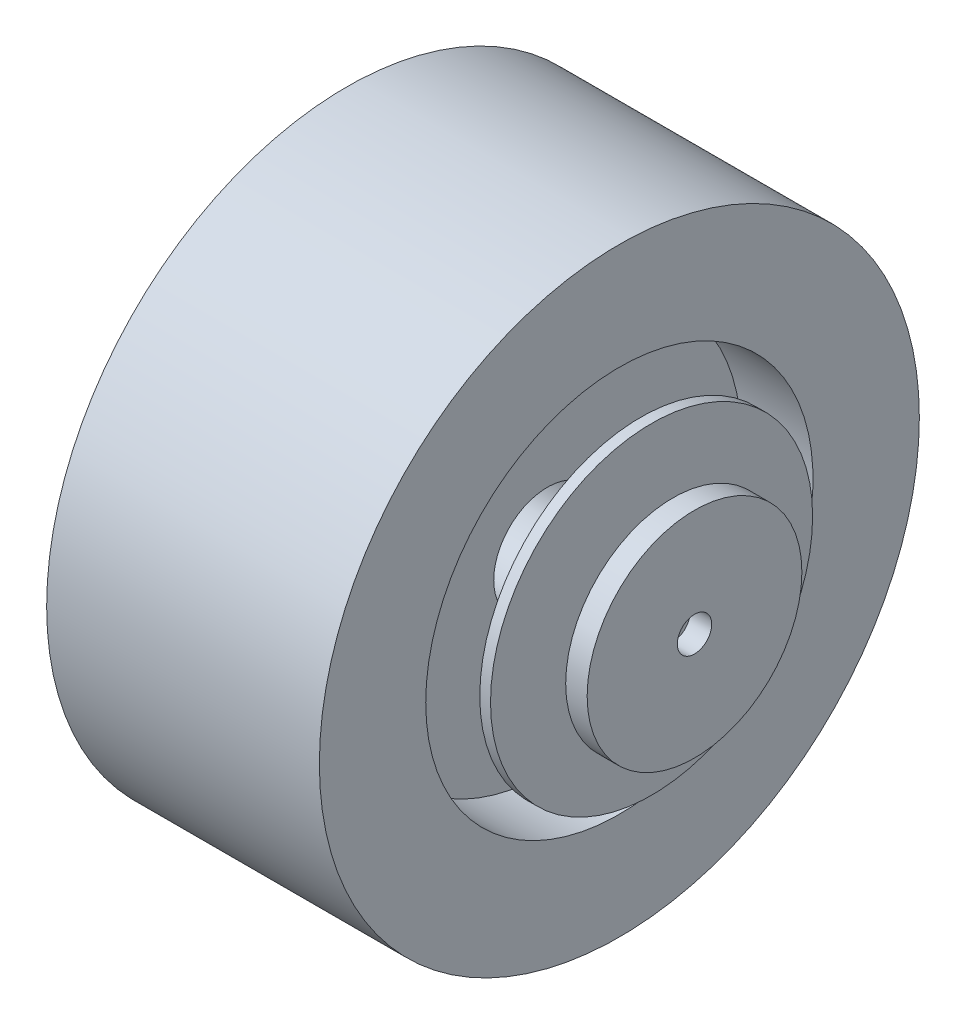
ISO-10303-21;
HEADER;
FILE_DESCRIPTION(('STEP AP214'),'2;1');
FILE_NAME('part.step','',(''),(''),'','','');
FILE_SCHEMA(('AUTOMOTIVE_DESIGN { 1 0 10303 214 1 1 1 1 }'));
ENDSEC;
DATA;
#1=APPLICATION_CONTEXT('core data for automotive mechanical design processes');
#2=APPLICATION_PROTOCOL_DEFINITION('international standard','automotive_design',2000,#1);
#3=PRODUCT_CONTEXT('',#1,'mechanical');
#4=PRODUCT('Part','Part','',(#3));
#5=PRODUCT_RELATED_PRODUCT_CATEGORY('part','',(#4));
#6=PRODUCT_DEFINITION_FORMATION('','',#4);
#7=PRODUCT_DEFINITION_CONTEXT('part definition',#1,'design');
#8=PRODUCT_DEFINITION('design','',#6,#7);
#9=PRODUCT_DEFINITION_SHAPE('','',#8);
#10=(LENGTH_UNIT() NAMED_UNIT(*) SI_UNIT(.MILLI.,.METRE.));
#11=(NAMED_UNIT(*) PLANE_ANGLE_UNIT() SI_UNIT($,.RADIAN.));
#12=(NAMED_UNIT(*) SI_UNIT($,.STERADIAN.) SOLID_ANGLE_UNIT());
#13=UNCERTAINTY_MEASURE_WITH_UNIT(LENGTH_MEASURE(1.E-05),#10,'distance_accuracy_value','');
#14=(GEOMETRIC_REPRESENTATION_CONTEXT(3) GLOBAL_UNCERTAINTY_ASSIGNED_CONTEXT((#13)) GLOBAL_UNIT_ASSIGNED_CONTEXT((#10,
#11,#12)) REPRESENTATION_CONTEXT('',''));
#15=CARTESIAN_POINT('',(0.,0.,0.));
#16=DIRECTION('',(0.,0.,1.));
#17=DIRECTION('',(1.,0.,0.));
#18=AXIS2_PLACEMENT_3D('',#15,#16,#17);
#19=CARTESIAN_POINT('',(98.5,0.,0.));
#20=DIRECTION('',(-1.,0.,0.));
#21=DIRECTION('',(0.,0.,1.));
#22=AXIS2_PLACEMENT_3D('',#19,#20,#21);
#23=CYLINDRICAL_SURFACE('',#22,50.);
#24=CARTESIAN_POINT('',(98.5,0.,0.));
#25=DIRECTION('',(1.,0.,0.));
#26=DIRECTION('',(0.,0.,-1.));
#27=AXIS2_PLACEMENT_3D('',#24,#25,#26);
#28=CIRCLE('',#27,50.);
#29=CARTESIAN_POINT('',(98.5,0.,-50.));
#30=VERTEX_POINT('',#29);
#31=EDGE_CURVE('E11',#30,#30,#28,.T.);
#32=ORIENTED_EDGE('',*,*,#31,.F.);
#33=EDGE_LOOP('',(#32));
#34=FACE_BOUND('',#33,.T.);
#35=CARTESIAN_POINT('',(88.5,0.,0.));
#36=DIRECTION('',(1.,0.,0.));
#37=DIRECTION('',(0.,0.,-1.));
#38=AXIS2_PLACEMENT_3D('',#35,#36,#37);
#39=CIRCLE('',#38,50.);
#40=CARTESIAN_POINT('',(88.5,0.,-50.));
#41=VERTEX_POINT('',#40);
#42=EDGE_CURVE('E63',#41,#41,#39,.T.);
#43=ORIENTED_EDGE('',*,*,#42,.T.);
#44=EDGE_LOOP('',(#43));
#45=FACE_BOUND('',#44,.T.);
#46=ADVANCED_FACE('F56',(#34,#45),#23,.T.);
#47=CARTESIAN_POINT('',(98.5,0.,0.));
#48=DIRECTION('',(1.,0.,0.));
#49=DIRECTION('',(0.,0.,-1.));
#50=AXIS2_PLACEMENT_3D('',#47,#48,#49);
#51=PLANE('',#50);
#52=CARTESIAN_POINT('',(98.5,0.,0.));
#53=DIRECTION('',(1.,0.,0.));
#54=DIRECTION('',(0.,0.,-1.));
#55=AXIS2_PLACEMENT_3D('',#52,#53,#54);
#56=CIRCLE('',#55,8.);
#57=CARTESIAN_POINT('',(98.5,0.,-8.));
#58=VERTEX_POINT('',#57);
#59=EDGE_CURVE('E69',#58,#58,#56,.T.);
#60=ORIENTED_EDGE('',*,*,#59,.F.);
#61=EDGE_LOOP('',(#60));
#62=FACE_BOUND('',#61,.T.);
#63=ORIENTED_EDGE('',*,*,#31,.T.);
#64=EDGE_LOOP('',(#63));
#65=FACE_BOUND('',#64,.T.);
#66=ADVANCED_FACE('F85',(#62,#65),#51,.T.);
#67=CARTESIAN_POINT('',(88.5,0.,0.));
#68=DIRECTION('',(1.,0.,0.));
#69=DIRECTION('',(0.,0.,-1.));
#70=AXIS2_PLACEMENT_3D('',#67,#68,#69);
#71=PLANE('',#70);
#72=CARTESIAN_POINT('',(88.5,0.,0.));
#73=DIRECTION('',(1.,0.,0.));
#74=DIRECTION('',(0.,0.,-1.));
#75=AXIS2_PLACEMENT_3D('',#72,#73,#74);
#76=CIRCLE('',#75,8.);
#77=CARTESIAN_POINT('',(88.5,0.,-8.));
#78=VERTEX_POINT('',#77);
#79=EDGE_CURVE('E59',#78,#78,#76,.T.);
#80=ORIENTED_EDGE('',*,*,#79,.T.);
#81=EDGE_LOOP('',(#80));
#82=FACE_BOUND('',#81,.T.);
#83=ORIENTED_EDGE('',*,*,#42,.F.);
#84=EDGE_LOOP('',(#83));
#85=FACE_BOUND('',#84,.T.);
#86=ADVANCED_FACE('F76',(#82,#85),#71,.F.);
#87=CARTESIAN_POINT('',(-63.5,0.,0.));
#88=DIRECTION('',(1.,0.,0.));
#89=DIRECTION('',(0.,0.,-1.));
#90=AXIS2_PLACEMENT_3D('',#87,#88,#89);
#91=CYLINDRICAL_SURFACE('',#90,8.);
#92=ORIENTED_EDGE('',*,*,#59,.T.);
#93=EDGE_LOOP('',(#92));
#94=FACE_BOUND('',#93,.T.);
#95=ORIENTED_EDGE('',*,*,#79,.F.);
#96=EDGE_LOOP('',(#95));
#97=FACE_BOUND('',#96,.T.);
#98=ADVANCED_FACE('F79',(#94,#97),#91,.F.);
#99=CLOSED_SHELL('',(#46,#66,#86,#98));
#100=MANIFOLD_SOLID_BREP('B2',#99);
#101=CARTESIAN_POINT('',(78.5,0.,0.));
#102=DIRECTION('',(-1.,0.,0.));
#103=DIRECTION('',(0.,0.,1.));
#104=AXIS2_PLACEMENT_3D('',#101,#102,#103);
#105=CYLINDRICAL_SURFACE('',#104,75.);
#106=CARTESIAN_POINT('',(78.5,0.,0.));
#107=DIRECTION('',(1.,0.,0.));
#108=DIRECTION('',(0.,0.,-1.));
#109=AXIS2_PLACEMENT_3D('',#106,#107,#108);
#110=CIRCLE('',#109,75.);
#111=CARTESIAN_POINT('',(78.5,0.,-75.));
#112=VERTEX_POINT('',#111);
#113=EDGE_CURVE('E55',#112,#112,#110,.T.);
#114=ORIENTED_EDGE('',*,*,#113,.F.);
#115=EDGE_LOOP('',(#114));
#116=FACE_BOUND('',#115,.T.);
#117=CARTESIAN_POINT('',(73.5,0.,0.));
#118=DIRECTION('',(1.,0.,0.));
#119=DIRECTION('',(0.,0.,-1.));
#120=AXIS2_PLACEMENT_3D('',#117,#118,#119);
#121=CIRCLE('',#120,75.);
#122=CARTESIAN_POINT('',(73.5,0.,-75.));
#123=VERTEX_POINT('',#122);
#124=EDGE_CURVE('E132',#123,#123,#121,.T.);
#125=ORIENTED_EDGE('',*,*,#124,.T.);
#126=EDGE_LOOP('',(#125));
#127=FACE_BOUND('',#126,.T.);
#128=ADVANCED_FACE('F125',(#116,#127),#105,.T.);
#129=CARTESIAN_POINT('',(78.5,0.,0.));
#130=DIRECTION('',(1.,0.,0.));
#131=DIRECTION('',(0.,0.,-1.));
#132=AXIS2_PLACEMENT_3D('',#129,#130,#131);
#133=PLANE('',#132);
#134=CARTESIAN_POINT('',(78.5,0.,0.));
#135=DIRECTION('',(1.,0.,0.));
#136=DIRECTION('',(0.,0.,-1.));
#137=AXIS2_PLACEMENT_3D('',#134,#135,#136);
#138=CIRCLE('',#137,8.);
#139=CARTESIAN_POINT('',(78.5,0.,-8.));
#140=VERTEX_POINT('',#139);
#141=EDGE_CURVE('E137',#140,#140,#138,.T.);
#142=ORIENTED_EDGE('',*,*,#141,.F.);
#143=EDGE_LOOP('',(#142));
#144=FACE_BOUND('',#143,.T.);
#145=ORIENTED_EDGE('',*,*,#113,.T.);
#146=EDGE_LOOP('',(#145));
#147=FACE_BOUND('',#146,.T.);
#148=ADVANCED_FACE('F154',(#144,#147),#133,.T.);
#149=CARTESIAN_POINT('',(73.5,0.,0.));
#150=DIRECTION('',(1.,0.,0.));
#151=DIRECTION('',(0.,0.,-1.));
#152=AXIS2_PLACEMENT_3D('',#149,#150,#151);
#153=PLANE('',#152);
#154=CARTESIAN_POINT('',(73.5,0.,0.));
#155=DIRECTION('',(1.,0.,0.));
#156=DIRECTION('',(0.,0.,-1.));
#157=AXIS2_PLACEMENT_3D('',#154,#155,#156);
#158=CIRCLE('',#157,8.);
#159=CARTESIAN_POINT('',(73.5,0.,-8.));
#160=VERTEX_POINT('',#159);
#161=EDGE_CURVE('E128',#160,#160,#158,.T.);
#162=ORIENTED_EDGE('',*,*,#161,.T.);
#163=EDGE_LOOP('',(#162));
#164=FACE_BOUND('',#163,.T.);
#165=ORIENTED_EDGE('',*,*,#124,.F.);
#166=EDGE_LOOP('',(#165));
#167=FACE_BOUND('',#166,.T.);
#168=ADVANCED_FACE('F145',(#164,#167),#153,.F.);
#169=CARTESIAN_POINT('',(-63.5,0.,0.));
#170=DIRECTION('',(1.,0.,0.));
#171=DIRECTION('',(0.,0.,-1.));
#172=AXIS2_PLACEMENT_3D('',#169,#170,#171);
#173=CYLINDRICAL_SURFACE('',#172,8.);
#174=ORIENTED_EDGE('',*,*,#141,.T.);
#175=EDGE_LOOP('',(#174));
#176=FACE_BOUND('',#175,.T.);
#177=ORIENTED_EDGE('',*,*,#161,.F.);
#178=EDGE_LOOP('',(#177));
#179=FACE_BOUND('',#178,.T.);
#180=ADVANCED_FACE('F148',(#176,#179),#173,.F.);
#181=CLOSED_SHELL('',(#128,#148,#168,#180));
#182=MANIFOLD_SOLID_BREP('B6',#181);
#183=CARTESIAN_POINT('',(-62.8571428571427,0.,0.));
#184=DIRECTION('',(-1.,0.,0.));
#185=DIRECTION('',(0.,0.,1.));
#186=AXIS2_PLACEMENT_3D('',#183,#184,#185);
#187=CYLINDRICAL_SURFACE('',#186,139.7);
#188=CARTESIAN_POINT('',(-63.5,0.,0.));
#189=DIRECTION('',(-1.,0.,0.));
#190=DIRECTION('',(0.,0.,1.));
#191=AXIS2_PLACEMENT_3D('',#188,#189,#190);
#192=CIRCLE('',#191,139.7);
#193=CARTESIAN_POINT('',(-63.5,0.,139.7));
#194=VERTEX_POINT('',#193);
#195=EDGE_CURVE('E124',#194,#194,#192,.T.);
#196=ORIENTED_EDGE('',*,*,#195,.F.);
#197=EDGE_LOOP('',(#196));
#198=FACE_BOUND('',#197,.T.);
#199=CARTESIAN_POINT('',(63.5,0.,0.));
#200=DIRECTION('',(-1.,0.,0.));
#201=DIRECTION('',(0.,0.,1.));
#202=AXIS2_PLACEMENT_3D('',#199,#200,#201);
#203=CIRCLE('',#202,139.7);
#204=CARTESIAN_POINT('',(63.5,0.,139.7));
#205=VERTEX_POINT('',#204);
#206=EDGE_CURVE('E206',#205,#205,#203,.T.);
#207=ORIENTED_EDGE('',*,*,#206,.T.);
#208=EDGE_LOOP('',(#207));
#209=FACE_BOUND('',#208,.T.);
#210=ADVANCED_FACE('F187',(#198,#209),#187,.T.);
#211=CARTESIAN_POINT('',(-63.5,-139.7,0.));
#212=DIRECTION('',(-1.,0.,0.));
#213=DIRECTION('',(0.,0.,1.));
#214=AXIS2_PLACEMENT_3D('',#211,#212,#213);
#215=PLANE('',#214);
#216=ORIENTED_EDGE('',*,*,#195,.T.);
#217=EDGE_LOOP('',(#216));
#218=FACE_BOUND('',#217,.T.);
#219=CARTESIAN_POINT('',(-63.5,0.,0.));
#220=DIRECTION('',(-1.,0.,0.));
#221=DIRECTION('',(0.,0.,1.));
#222=AXIS2_PLACEMENT_3D('',#219,#220,#221);
#223=CIRCLE('',#222,90.17);
#224=CARTESIAN_POINT('',(-63.5,0.,90.17));
#225=VERTEX_POINT('',#224);
#226=EDGE_CURVE('E193',#225,#225,#223,.T.);
#227=ORIENTED_EDGE('',*,*,#226,.F.);
#228=EDGE_LOOP('',(#227));
#229=FACE_BOUND('',#228,.T.);
#230=ADVANCED_FACE('F238',(#218,#229),#215,.T.);
#231=CARTESIAN_POINT('',(-62.8571428571427,0.,0.));
#232=DIRECTION('',(-1.,0.,0.));
#233=DIRECTION('',(0.,0.,1.));
#234=AXIS2_PLACEMENT_3D('',#231,#232,#233);
#235=CYLINDRICAL_SURFACE('',#234,90.17);
#236=ORIENTED_EDGE('',*,*,#226,.T.);
#237=EDGE_LOOP('',(#236));
#238=FACE_BOUND('',#237,.T.);
#239=CARTESIAN_POINT('',(-30.,0.,0.));
#240=DIRECTION('',(-1.,0.,0.));
#241=DIRECTION('',(0.,0.,1.));
#242=AXIS2_PLACEMENT_3D('',#239,#240,#241);
#243=CIRCLE('',#242,90.17);
#244=CARTESIAN_POINT('',(-30.,0.,90.17));
#245=VERTEX_POINT('',#244);
#246=EDGE_CURVE('E197',#245,#245,#243,.T.);
#247=ORIENTED_EDGE('',*,*,#246,.F.);
#248=EDGE_LOOP('',(#247));
#249=FACE_BOUND('',#248,.T.);
#250=ADVANCED_FACE('F235',(#238,#249),#235,.F.);
#251=CARTESIAN_POINT('',(-30.,-90.17,0.));
#252=DIRECTION('',(-1.,0.,0.));
#253=DIRECTION('',(0.,0.,1.));
#254=AXIS2_PLACEMENT_3D('',#251,#252,#253);
#255=PLANE('',#254);
#256=ORIENTED_EDGE('',*,*,#246,.T.);
#257=EDGE_LOOP('',(#256));
#258=FACE_BOUND('',#257,.T.);
#259=CARTESIAN_POINT('',(-30.,0.,0.));
#260=DIRECTION('',(-1.,0.,0.));
#261=DIRECTION('',(0.,0.,1.));
#262=AXIS2_PLACEMENT_3D('',#259,#260,#261);
#263=CIRCLE('',#262,25.);
#264=CARTESIAN_POINT('',(-30.,0.,25.));
#265=VERTEX_POINT('',#264);
#266=EDGE_CURVE('E201',#265,#265,#263,.T.);
#267=ORIENTED_EDGE('',*,*,#266,.F.);
#268=EDGE_LOOP('',(#267));
#269=FACE_BOUND('',#268,.T.);
#270=ADVANCED_FACE('F224',(#258,#269),#255,.T.);
#271=CARTESIAN_POINT('',(-62.8571428571427,0.,0.));
#272=DIRECTION('',(-1.,0.,0.));
#273=DIRECTION('',(0.,0.,1.));
#274=AXIS2_PLACEMENT_3D('',#271,#272,#273);
#275=CYLINDRICAL_SURFACE('',#274,25.);
#276=ORIENTED_EDGE('',*,*,#266,.T.);
#277=EDGE_LOOP('',(#276));
#278=FACE_BOUND('',#277,.T.);
#279=CARTESIAN_POINT('',(30.,0.,0.));
#280=DIRECTION('',(-1.,0.,0.));
#281=DIRECTION('',(0.,0.,1.));
#282=AXIS2_PLACEMENT_3D('',#279,#280,#281);
#283=CIRCLE('',#282,25.);
#284=CARTESIAN_POINT('',(30.,0.,25.));
#285=VERTEX_POINT('',#284);
#286=EDGE_CURVE('E215',#285,#285,#283,.T.);
#287=ORIENTED_EDGE('',*,*,#286,.F.);
#288=EDGE_LOOP('',(#287));
#289=FACE_BOUND('',#288,.T.);
#290=ADVANCED_FACE('F221',(#278,#289),#275,.F.);
#291=CARTESIAN_POINT('',(63.5,-139.7,0.));
#292=DIRECTION('',(1.,0.,0.));
#293=DIRECTION('',(0.,0.,1.));
#294=AXIS2_PLACEMENT_3D('',#291,#292,#293);
#295=PLANE('',#294);
#296=ORIENTED_EDGE('',*,*,#206,.F.);
#297=EDGE_LOOP('',(#296));
#298=FACE_BOUND('',#297,.T.);
#299=CARTESIAN_POINT('',(63.5,0.,0.));
#300=DIRECTION('',(-1.,0.,0.));
#301=DIRECTION('',(0.,0.,1.));
#302=AXIS2_PLACEMENT_3D('',#299,#300,#301);
#303=CIRCLE('',#302,90.17);
#304=CARTESIAN_POINT('',(63.5,0.,90.17));
#305=VERTEX_POINT('',#304);
#306=EDGE_CURVE('E209',#305,#305,#303,.T.);
#307=ORIENTED_EDGE('',*,*,#306,.T.);
#308=EDGE_LOOP('',(#307));
#309=FACE_BOUND('',#308,.T.);
#310=ADVANCED_FACE('F223',(#298,#309),#295,.T.);
#311=CARTESIAN_POINT('',(62.8571428571427,0.,0.));
#312=DIRECTION('',(1.,0.,0.));
#313=DIRECTION('',(0.,0.,1.));
#314=AXIS2_PLACEMENT_3D('',#311,#312,#313);
#315=CYLINDRICAL_SURFACE('',#314,90.17);
#316=ORIENTED_EDGE('',*,*,#306,.F.);
#317=EDGE_LOOP('',(#316));
#318=FACE_BOUND('',#317,.T.);
#319=CARTESIAN_POINT('',(30.,0.,0.));
#320=DIRECTION('',(-1.,0.,0.));
#321=DIRECTION('',(0.,0.,1.));
#322=AXIS2_PLACEMENT_3D('',#319,#320,#321);
#323=CIRCLE('',#322,90.17);
#324=CARTESIAN_POINT('',(30.,0.,90.17));
#325=VERTEX_POINT('',#324);
#326=EDGE_CURVE('E212',#325,#325,#323,.T.);
#327=ORIENTED_EDGE('',*,*,#326,.T.);
#328=EDGE_LOOP('',(#327));
#329=FACE_BOUND('',#328,.T.);
#330=ADVANCED_FACE('F231',(#318,#329),#315,.F.);
#331=CARTESIAN_POINT('',(30.,-90.17,0.));
#332=DIRECTION('',(1.,0.,0.));
#333=DIRECTION('',(0.,0.,1.));
#334=AXIS2_PLACEMENT_3D('',#331,#332,#333);
#335=PLANE('',#334);
#336=ORIENTED_EDGE('',*,*,#326,.F.);
#337=EDGE_LOOP('',(#336));
#338=FACE_BOUND('',#337,.T.);
#339=ORIENTED_EDGE('',*,*,#286,.T.);
#340=EDGE_LOOP('',(#339));
#341=FACE_BOUND('',#340,.T.);
#342=ADVANCED_FACE('F219',(#338,#341),#335,.T.);
#343=CLOSED_SHELL('',(#210,#230,#250,#270,#290,#310,#330,#342));
#344=MANIFOLD_SOLID_BREP('B50',#343);
#345=ADVANCED_BREP_SHAPE_REPRESENTATION('',(#18,#100,#182,#344),#14);
#346=SHAPE_DEFINITION_REPRESENTATION(#9,#345);
ENDSEC;
END-ISO-10303-21;
